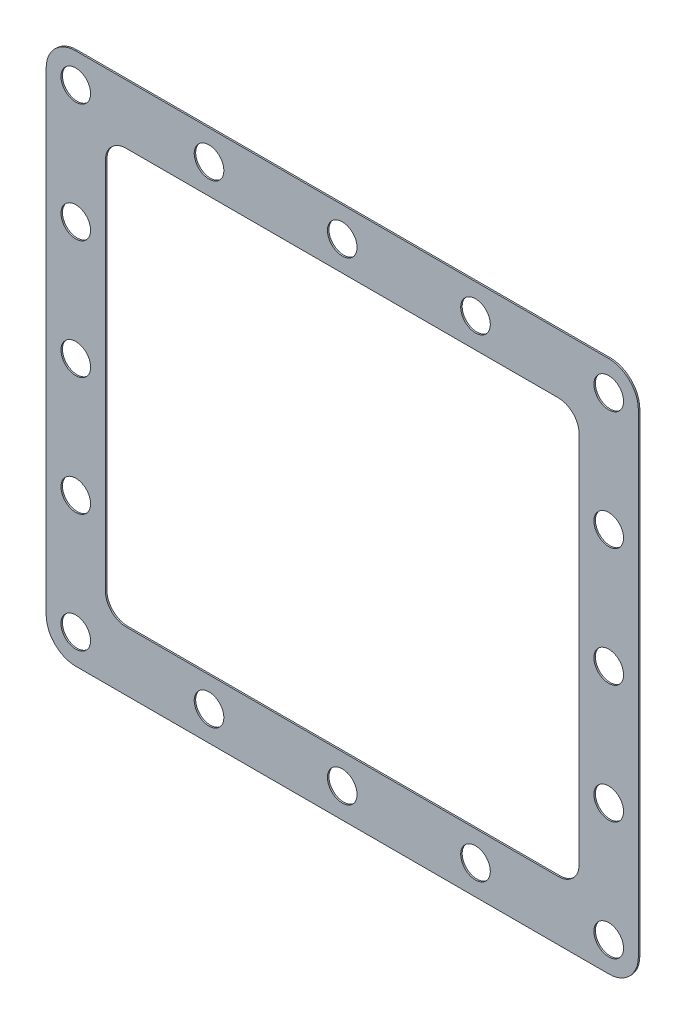
ISO-10303-21;
HEADER;
FILE_DESCRIPTION(('STEP AP214'),'2;1');
FILE_NAME('part.step','',(''),(''),'','','');
FILE_SCHEMA(('AUTOMOTIVE_DESIGN { 1 0 10303 214 1 1 1 1 }'));
ENDSEC;
DATA;
#1=APPLICATION_CONTEXT('core data for automotive mechanical design processes');
#2=APPLICATION_PROTOCOL_DEFINITION('international standard','automotive_design',2000,#1);
#3=PRODUCT_CONTEXT('',#1,'mechanical');
#4=PRODUCT('Part','Part','',(#3));
#5=PRODUCT_RELATED_PRODUCT_CATEGORY('part','',(#4));
#6=PRODUCT_DEFINITION_FORMATION('','',#4);
#7=PRODUCT_DEFINITION_CONTEXT('part definition',#1,'design');
#8=PRODUCT_DEFINITION('design','',#6,#7);
#9=PRODUCT_DEFINITION_SHAPE('','',#8);
#10=(LENGTH_UNIT() NAMED_UNIT(*) SI_UNIT(.MILLI.,.METRE.));
#11=(NAMED_UNIT(*) PLANE_ANGLE_UNIT() SI_UNIT($,.RADIAN.));
#12=(NAMED_UNIT(*) SI_UNIT($,.STERADIAN.) SOLID_ANGLE_UNIT());
#13=UNCERTAINTY_MEASURE_WITH_UNIT(LENGTH_MEASURE(1.E-05),#10,'distance_accuracy_value','');
#14=(GEOMETRIC_REPRESENTATION_CONTEXT(3) GLOBAL_UNCERTAINTY_ASSIGNED_CONTEXT((#13)) GLOBAL_UNIT_ASSIGNED_CONTEXT((#10,
#11,#12)) REPRESENTATION_CONTEXT('',''));
#15=CARTESIAN_POINT('',(0.,0.,0.));
#16=DIRECTION('',(0.,0.,1.));
#17=DIRECTION('',(1.,0.,0.));
#18=AXIS2_PLACEMENT_3D('',#15,#16,#17);
#19=CARTESIAN_POINT('',(90.,80.,0.5));
#20=DIRECTION('',(0.,0.,-1.));
#21=DIRECTION('',(-1.,0.,0.));
#22=AXIS2_PLACEMENT_3D('',#19,#20,#21);
#23=PLANE('',#22);
#24=CARTESIAN_POINT('',(90.,80.,0.5));
#25=DIRECTION('',(0.,0.,1.));
#26=DIRECTION('',(-1.,0.,0.));
#27=AXIS2_PLACEMENT_3D('',#24,#25,#26);
#28=CIRCLE('',#27,9.99999999999999);
#29=CARTESIAN_POINT('',(100.,79.9999999999999,0.5));
#30=VERTEX_POINT('',#29);
#31=CARTESIAN_POINT('',(89.9999999999999,90.,0.5));
#32=VERTEX_POINT('',#31);
#33=EDGE_CURVE('E217',#30,#32,#28,.T.);
#34=ORIENTED_EDGE('',*,*,#33,.T.);
#35=DIRECTION('',(-1.,0.,0.));
#36=VECTOR('',#35,1.);
#37=CARTESIAN_POINT('',(-89.9999999999999,90.,0.5));
#38=LINE('',#37,#36);
#39=CARTESIAN_POINT('',(-89.9999999999999,90.,0.5));
#40=VERTEX_POINT('',#39);
#41=EDGE_CURVE('E220',#32,#40,#38,.T.);
#42=ORIENTED_EDGE('',*,*,#41,.T.);
#43=CARTESIAN_POINT('',(-90.,80.,0.5));
#44=DIRECTION('',(0.,0.,1.));
#45=DIRECTION('',(-1.,0.,0.));
#46=AXIS2_PLACEMENT_3D('',#43,#44,#45);
#47=CIRCLE('',#46,9.99999999999999);
#48=CARTESIAN_POINT('',(-100.,79.9999999999999,0.5));
#49=VERTEX_POINT('',#48);
#50=EDGE_CURVE('E223',#40,#49,#47,.T.);
#51=ORIENTED_EDGE('',*,*,#50,.T.);
#52=DIRECTION('',(0.,-1.,0.));
#53=VECTOR('',#52,1.);
#54=CARTESIAN_POINT('',(-100.,-79.9999999999999,0.5));
#55=LINE('',#54,#53);
#56=CARTESIAN_POINT('',(-100.,-79.9999999999999,0.5));
#57=VERTEX_POINT('',#56);
#58=EDGE_CURVE('E225',#49,#57,#55,.T.);
#59=ORIENTED_EDGE('',*,*,#58,.T.);
#60=CARTESIAN_POINT('',(-90.,-80.,0.5));
#61=DIRECTION('',(0.,0.,1.));
#62=DIRECTION('',(-1.,0.,0.));
#63=AXIS2_PLACEMENT_3D('',#60,#61,#62);
#64=CIRCLE('',#63,9.99999999999999);
#65=CARTESIAN_POINT('',(-89.9999999999999,-90.,0.5));
#66=VERTEX_POINT('',#65);
#67=EDGE_CURVE('E227',#57,#66,#64,.T.);
#68=ORIENTED_EDGE('',*,*,#67,.T.);
#69=DIRECTION('',(1.,0.,0.));
#70=VECTOR('',#69,1.);
#71=CARTESIAN_POINT('',(-89.9999999999999,-90.,0.5));
#72=LINE('',#71,#70);
#73=CARTESIAN_POINT('',(89.9999999999999,-90.,0.5));
#74=VERTEX_POINT('',#73);
#75=EDGE_CURVE('E229',#66,#74,#72,.T.);
#76=ORIENTED_EDGE('',*,*,#75,.T.);
#77=CARTESIAN_POINT('',(90.,-80.,0.5));
#78=DIRECTION('',(0.,0.,1.));
#79=DIRECTION('',(1.,0.,0.));
#80=AXIS2_PLACEMENT_3D('',#77,#78,#79);
#81=CIRCLE('',#80,9.99999999999999);
#82=CARTESIAN_POINT('',(100.,-80.,0.5));
#83=VERTEX_POINT('',#82);
#84=EDGE_CURVE('E231',#74,#83,#81,.T.);
#85=ORIENTED_EDGE('',*,*,#84,.T.);
#86=DIRECTION('',(0.,1.,0.));
#87=VECTOR('',#86,1.);
#88=CARTESIAN_POINT('',(100.,-79.9999999999999,0.5));
#89=LINE('',#88,#87);
#90=EDGE_CURVE('E233',#83,#30,#89,.T.);
#91=ORIENTED_EDGE('',*,*,#90,.T.);
#92=EDGE_LOOP('',(#34,#42,#51,#59,#68,#76,#85,#91));
#93=FACE_BOUND('',#92,.T.);
#94=CARTESIAN_POINT('',(73.,63.,0.5));
#95=DIRECTION('',(0.,0.,1.));
#96=DIRECTION('',(-1.,0.,0.));
#97=AXIS2_PLACEMENT_3D('',#94,#95,#96);
#98=CIRCLE('',#97,7.);
#99=CARTESIAN_POINT('',(80.,63.,0.5));
#100=VERTEX_POINT('',#99);
#101=CARTESIAN_POINT('',(73.,70.,0.5));
#102=VERTEX_POINT('',#101);
#103=EDGE_CURVE('E149',#100,#102,#98,.T.);
#104=ORIENTED_EDGE('',*,*,#103,.F.);
#105=DIRECTION('',(0.,1.,0.));
#106=VECTOR('',#105,1.);
#107=CARTESIAN_POINT('',(80.,-63.,0.5));
#108=LINE('',#107,#106);
#109=CARTESIAN_POINT('',(80.,-63.,0.5));
#110=VERTEX_POINT('',#109);
#111=EDGE_CURVE('E184',#110,#100,#108,.T.);
#112=ORIENTED_EDGE('',*,*,#111,.F.);
#113=CARTESIAN_POINT('',(73.,-63.,0.5));
#114=DIRECTION('',(0.,0.,1.));
#115=DIRECTION('',(1.,0.,0.));
#116=AXIS2_PLACEMENT_3D('',#113,#114,#115);
#117=CIRCLE('',#116,7.00000000000001);
#118=CARTESIAN_POINT('',(73.,-70.,0.5));
#119=VERTEX_POINT('',#118);
#120=EDGE_CURVE('E182',#119,#110,#117,.T.);
#121=ORIENTED_EDGE('',*,*,#120,.F.);
#122=DIRECTION('',(1.,0.,0.));
#123=VECTOR('',#122,1.);
#124=CARTESIAN_POINT('',(-73.,-70.,0.5));
#125=LINE('',#124,#123);
#126=CARTESIAN_POINT('',(-73.,-70.,0.5));
#127=VERTEX_POINT('',#126);
#128=EDGE_CURVE('E180',#127,#119,#125,.T.);
#129=ORIENTED_EDGE('',*,*,#128,.F.);
#130=CARTESIAN_POINT('',(-73.,-63.,0.5));
#131=DIRECTION('',(0.,0.,1.));
#132=DIRECTION('',(-1.,0.,0.));
#133=AXIS2_PLACEMENT_3D('',#130,#131,#132);
#134=CIRCLE('',#133,7.00000000000001);
#135=CARTESIAN_POINT('',(-80.,-63.,0.5));
#136=VERTEX_POINT('',#135);
#137=EDGE_CURVE('E178',#136,#127,#134,.T.);
#138=ORIENTED_EDGE('',*,*,#137,.F.);
#139=DIRECTION('',(0.,-1.,0.));
#140=VECTOR('',#139,1.);
#141=CARTESIAN_POINT('',(-80.,-63.,0.5));
#142=LINE('',#141,#140);
#143=CARTESIAN_POINT('',(-80.,63.,0.5));
#144=VERTEX_POINT('',#143);
#145=EDGE_CURVE('E173',#144,#136,#142,.T.);
#146=ORIENTED_EDGE('',*,*,#145,.F.);
#147=CARTESIAN_POINT('',(-73.,63.,0.5));
#148=DIRECTION('',(0.,0.,1.));
#149=DIRECTION('',(-1.,0.,0.));
#150=AXIS2_PLACEMENT_3D('',#147,#148,#149);
#151=CIRCLE('',#150,7.00000000000001);
#152=CARTESIAN_POINT('',(-73.,70.,0.5));
#153=VERTEX_POINT('',#152);
#154=EDGE_CURVE('E171',#153,#144,#151,.T.);
#155=ORIENTED_EDGE('',*,*,#154,.F.);
#156=DIRECTION('',(-1.,0.,0.));
#157=VECTOR('',#156,1.);
#158=CARTESIAN_POINT('',(-73.,70.,0.5));
#159=LINE('',#158,#157);
#160=EDGE_CURVE('E157',#102,#153,#159,.T.);
#161=ORIENTED_EDGE('',*,*,#160,.F.);
#162=EDGE_LOOP('',(#104,#112,#121,#129,#138,#146,#155,#161));
#163=FACE_BOUND('',#162,.T.);
#164=CARTESIAN_POINT('',(90.,-80.,0.5));
#165=DIRECTION('',(0.,0.,1.));
#166=DIRECTION('',(1.,0.,0.));
#167=AXIS2_PLACEMENT_3D('',#164,#165,#166);
#168=CIRCLE('',#167,5.00000000000001);
#169=CARTESIAN_POINT('',(95.,-80.,0.5));
#170=VERTEX_POINT('',#169);
#171=EDGE_CURVE('E187',#170,#170,#168,.T.);
#172=ORIENTED_EDGE('',*,*,#171,.F.);
#173=EDGE_LOOP('',(#172));
#174=FACE_BOUND('',#173,.T.);
#175=CARTESIAN_POINT('',(90.,80.,0.5));
#176=DIRECTION('',(0.,0.,1.));
#177=DIRECTION('',(1.,0.,0.));
#178=AXIS2_PLACEMENT_3D('',#175,#176,#177);
#179=CIRCLE('',#178,5.00000000000001);
#180=CARTESIAN_POINT('',(95.,80.,0.5));
#181=VERTEX_POINT('',#180);
#182=EDGE_CURVE('E515',#181,#181,#179,.T.);
#183=ORIENTED_EDGE('',*,*,#182,.F.);
#184=EDGE_LOOP('',(#183));
#185=FACE_BOUND('',#184,.T.);
#186=CARTESIAN_POINT('',(-90.,80.,0.5));
#187=DIRECTION('',(0.,0.,1.));
#188=DIRECTION('',(1.,0.,0.));
#189=AXIS2_PLACEMENT_3D('',#186,#187,#188);
#190=CIRCLE('',#189,4.99999999999999);
#191=CARTESIAN_POINT('',(-85.,80.,0.5));
#192=VERTEX_POINT('',#191);
#193=EDGE_CURVE('E509',#192,#192,#190,.T.);
#194=ORIENTED_EDGE('',*,*,#193,.F.);
#195=EDGE_LOOP('',(#194));
#196=FACE_BOUND('',#195,.T.);
#197=CARTESIAN_POINT('',(-90.,-80.,0.5));
#198=DIRECTION('',(0.,0.,1.));
#199=DIRECTION('',(1.,0.,0.));
#200=AXIS2_PLACEMENT_3D('',#197,#198,#199);
#201=CIRCLE('',#200,5.00000000000001);
#202=CARTESIAN_POINT('',(-85.,-80.,0.5));
#203=VERTEX_POINT('',#202);
#204=EDGE_CURVE('E503',#203,#203,#201,.T.);
#205=ORIENTED_EDGE('',*,*,#204,.F.);
#206=EDGE_LOOP('',(#205));
#207=FACE_BOUND('',#206,.T.);
#208=CARTESIAN_POINT('',(90.,0.,0.5));
#209=DIRECTION('',(0.,0.,1.));
#210=DIRECTION('',(1.,0.,0.));
#211=AXIS2_PLACEMENT_3D('',#208,#209,#210);
#212=CIRCLE('',#211,5.);
#213=CARTESIAN_POINT('',(95.,0.,0.5));
#214=VERTEX_POINT('',#213);
#215=EDGE_CURVE('E497',#214,#214,#212,.T.);
#216=ORIENTED_EDGE('',*,*,#215,.F.);
#217=EDGE_LOOP('',(#216));
#218=FACE_BOUND('',#217,.T.);
#219=CARTESIAN_POINT('',(90.,-40.,0.5));
#220=DIRECTION('',(0.,0.,1.));
#221=DIRECTION('',(1.,0.,0.));
#222=AXIS2_PLACEMENT_3D('',#219,#220,#221);
#223=CIRCLE('',#222,5.00000000000001);
#224=CARTESIAN_POINT('',(95.,-40.,0.5));
#225=VERTEX_POINT('',#224);
#226=EDGE_CURVE('E491',#225,#225,#223,.T.);
#227=ORIENTED_EDGE('',*,*,#226,.F.);
#228=EDGE_LOOP('',(#227));
#229=FACE_BOUND('',#228,.T.);
#230=CARTESIAN_POINT('',(90.,40.,0.5));
#231=DIRECTION('',(0.,0.,1.));
#232=DIRECTION('',(1.,0.,0.));
#233=AXIS2_PLACEMENT_3D('',#230,#231,#232);
#234=CIRCLE('',#233,4.99999999999999);
#235=CARTESIAN_POINT('',(95.,40.,0.5));
#236=VERTEX_POINT('',#235);
#237=EDGE_CURVE('E485',#236,#236,#234,.T.);
#238=ORIENTED_EDGE('',*,*,#237,.F.);
#239=EDGE_LOOP('',(#238));
#240=FACE_BOUND('',#239,.T.);
#241=CARTESIAN_POINT('',(-90.0000000000001,-40.,0.5));
#242=DIRECTION('',(0.,0.,1.));
#243=DIRECTION('',(-1.,0.,0.));
#244=AXIS2_PLACEMENT_3D('',#241,#242,#243);
#245=CIRCLE('',#244,5.00000000000001);
#246=CARTESIAN_POINT('',(-95.0000000000001,-40.,0.5));
#247=VERTEX_POINT('',#246);
#248=EDGE_CURVE('E479',#247,#247,#245,.T.);
#249=ORIENTED_EDGE('',*,*,#248,.F.);
#250=EDGE_LOOP('',(#249));
#251=FACE_BOUND('',#250,.T.);
#252=CARTESIAN_POINT('',(-90.0000000000001,0.,0.5));
#253=DIRECTION('',(0.,0.,1.));
#254=DIRECTION('',(-1.,0.,0.));
#255=AXIS2_PLACEMENT_3D('',#252,#253,#254);
#256=CIRCLE('',#255,5.);
#257=CARTESIAN_POINT('',(-95.0000000000001,0.,0.5));
#258=VERTEX_POINT('',#257);
#259=EDGE_CURVE('E473',#258,#258,#256,.T.);
#260=ORIENTED_EDGE('',*,*,#259,.F.);
#261=EDGE_LOOP('',(#260));
#262=FACE_BOUND('',#261,.T.);
#263=CARTESIAN_POINT('',(-90.0000000000001,40.,0.5));
#264=DIRECTION('',(0.,0.,1.));
#265=DIRECTION('',(-1.,0.,0.));
#266=AXIS2_PLACEMENT_3D('',#263,#264,#265);
#267=CIRCLE('',#266,4.99999999999999);
#268=CARTESIAN_POINT('',(-95.0000000000001,40.,0.5));
#269=VERTEX_POINT('',#268);
#270=EDGE_CURVE('E467',#269,#269,#267,.T.);
#271=ORIENTED_EDGE('',*,*,#270,.F.);
#272=EDGE_LOOP('',(#271));
#273=FACE_BOUND('',#272,.T.);
#274=CARTESIAN_POINT('',(0.,80.,0.5));
#275=DIRECTION('',(0.,0.,1.));
#276=DIRECTION('',(1.,0.,0.));
#277=AXIS2_PLACEMENT_3D('',#274,#275,#276);
#278=CIRCLE('',#277,5.);
#279=CARTESIAN_POINT('',(4.99999999999998,80.,0.5));
#280=VERTEX_POINT('',#279);
#281=EDGE_CURVE('E461',#280,#280,#278,.T.);
#282=ORIENTED_EDGE('',*,*,#281,.F.);
#283=EDGE_LOOP('',(#282));
#284=FACE_BOUND('',#283,.T.);
#285=CARTESIAN_POINT('',(-45.,80.,0.5));
#286=DIRECTION('',(0.,0.,1.));
#287=DIRECTION('',(1.,0.,0.));
#288=AXIS2_PLACEMENT_3D('',#285,#286,#287);
#289=CIRCLE('',#288,5.);
#290=CARTESIAN_POINT('',(-40.,80.,0.5));
#291=VERTEX_POINT('',#290);
#292=EDGE_CURVE('E455',#291,#291,#289,.T.);
#293=ORIENTED_EDGE('',*,*,#292,.F.);
#294=EDGE_LOOP('',(#293));
#295=FACE_BOUND('',#294,.T.);
#296=CARTESIAN_POINT('',(45.,80.,0.5));
#297=DIRECTION('',(0.,0.,1.));
#298=DIRECTION('',(1.,0.,0.));
#299=AXIS2_PLACEMENT_3D('',#296,#297,#298);
#300=CIRCLE('',#299,5.00000000000001);
#301=CARTESIAN_POINT('',(50.,80.,0.5));
#302=VERTEX_POINT('',#301);
#303=EDGE_CURVE('E449',#302,#302,#300,.T.);
#304=ORIENTED_EDGE('',*,*,#303,.F.);
#305=EDGE_LOOP('',(#304));
#306=FACE_BOUND('',#305,.T.);
#307=CARTESIAN_POINT('',(0.,-80.,0.5));
#308=DIRECTION('',(0.,0.,1.));
#309=DIRECTION('',(1.,0.,0.));
#310=AXIS2_PLACEMENT_3D('',#307,#308,#309);
#311=CIRCLE('',#310,5.);
#312=CARTESIAN_POINT('',(4.99999999999997,-80.,0.5));
#313=VERTEX_POINT('',#312);
#314=EDGE_CURVE('E443',#313,#313,#311,.T.);
#315=ORIENTED_EDGE('',*,*,#314,.F.);
#316=EDGE_LOOP('',(#315));
#317=FACE_BOUND('',#316,.T.);
#318=CARTESIAN_POINT('',(-45.,-80.,0.5));
#319=DIRECTION('',(0.,0.,1.));
#320=DIRECTION('',(1.,0.,0.));
#321=AXIS2_PLACEMENT_3D('',#318,#319,#320);
#322=CIRCLE('',#321,5.);
#323=CARTESIAN_POINT('',(-40.,-80.,0.5));
#324=VERTEX_POINT('',#323);
#325=EDGE_CURVE('E437',#324,#324,#322,.T.);
#326=ORIENTED_EDGE('',*,*,#325,.F.);
#327=EDGE_LOOP('',(#326));
#328=FACE_BOUND('',#327,.T.);
#329=CARTESIAN_POINT('',(45.,-80.,0.5));
#330=DIRECTION('',(0.,0.,1.));
#331=DIRECTION('',(1.,0.,0.));
#332=AXIS2_PLACEMENT_3D('',#329,#330,#331);
#333=CIRCLE('',#332,5.00000000000001);
#334=CARTESIAN_POINT('',(50.,-80.,0.5));
#335=VERTEX_POINT('',#334);
#336=EDGE_CURVE('E428',#335,#335,#333,.T.);
#337=ORIENTED_EDGE('',*,*,#336,.F.);
#338=EDGE_LOOP('',(#337));
#339=FACE_BOUND('',#338,.T.);
#340=ADVANCED_FACE('F36',(#93,#163,#174,#185,#196,#207,#218,#229,#240,#251,#262,#273,#284,#295,
#306,#317,#328,#339),#23,.F.);
#341=CARTESIAN_POINT('',(90.,80.,0.));
#342=DIRECTION('',(0.,0.,-1.));
#343=DIRECTION('',(-1.,0.,0.));
#344=AXIS2_PLACEMENT_3D('',#341,#342,#343);
#345=PLANE('',#344);
#346=CARTESIAN_POINT('',(-45.,-80.,0.));
#347=DIRECTION('',(0.,0.,1.));
#348=DIRECTION('',(1.,0.,0.));
#349=AXIS2_PLACEMENT_3D('',#346,#347,#348);
#350=CIRCLE('',#349,5.);
#351=CARTESIAN_POINT('',(-40.,-80.,0.));
#352=VERTEX_POINT('',#351);
#353=EDGE_CURVE('E434',#352,#352,#350,.T.);
#354=ORIENTED_EDGE('',*,*,#353,.T.);
#355=EDGE_LOOP('',(#354));
#356=FACE_BOUND('',#355,.T.);
#357=CARTESIAN_POINT('',(45.,80.,0.));
#358=DIRECTION('',(0.,0.,1.));
#359=DIRECTION('',(1.,0.,0.));
#360=AXIS2_PLACEMENT_3D('',#357,#358,#359);
#361=CIRCLE('',#360,5.00000000000001);
#362=CARTESIAN_POINT('',(50.,80.,0.));
#363=VERTEX_POINT('',#362);
#364=EDGE_CURVE('E446',#363,#363,#361,.T.);
#365=ORIENTED_EDGE('',*,*,#364,.T.);
#366=EDGE_LOOP('',(#365));
#367=FACE_BOUND('',#366,.T.);
#368=CARTESIAN_POINT('',(0.,80.,0.));
#369=DIRECTION('',(0.,0.,1.));
#370=DIRECTION('',(1.,0.,0.));
#371=AXIS2_PLACEMENT_3D('',#368,#369,#370);
#372=CIRCLE('',#371,5.);
#373=CARTESIAN_POINT('',(4.99999999999998,80.,0.));
#374=VERTEX_POINT('',#373);
#375=EDGE_CURVE('E458',#374,#374,#372,.T.);
#376=ORIENTED_EDGE('',*,*,#375,.T.);
#377=EDGE_LOOP('',(#376));
#378=FACE_BOUND('',#377,.T.);
#379=CARTESIAN_POINT('',(-90.0000000000001,0.,0.));
#380=DIRECTION('',(0.,0.,1.));
#381=DIRECTION('',(-1.,0.,0.));
#382=AXIS2_PLACEMENT_3D('',#379,#380,#381);
#383=CIRCLE('',#382,5.);
#384=CARTESIAN_POINT('',(-95.0000000000001,0.,0.));
#385=VERTEX_POINT('',#384);
#386=EDGE_CURVE('E470',#385,#385,#383,.T.);
#387=ORIENTED_EDGE('',*,*,#386,.T.);
#388=EDGE_LOOP('',(#387));
#389=FACE_BOUND('',#388,.T.);
#390=CARTESIAN_POINT('',(90.,40.,0.));
#391=DIRECTION('',(0.,0.,1.));
#392=DIRECTION('',(1.,0.,0.));
#393=AXIS2_PLACEMENT_3D('',#390,#391,#392);
#394=CIRCLE('',#393,4.99999999999999);
#395=CARTESIAN_POINT('',(95.,40.,0.));
#396=VERTEX_POINT('',#395);
#397=EDGE_CURVE('E482',#396,#396,#394,.T.);
#398=ORIENTED_EDGE('',*,*,#397,.T.);
#399=EDGE_LOOP('',(#398));
#400=FACE_BOUND('',#399,.T.);
#401=CARTESIAN_POINT('',(90.,0.,0.));
#402=DIRECTION('',(0.,0.,1.));
#403=DIRECTION('',(1.,0.,0.));
#404=AXIS2_PLACEMENT_3D('',#401,#402,#403);
#405=CIRCLE('',#404,5.);
#406=CARTESIAN_POINT('',(95.,0.,0.));
#407=VERTEX_POINT('',#406);
#408=EDGE_CURVE('E494',#407,#407,#405,.T.);
#409=ORIENTED_EDGE('',*,*,#408,.T.);
#410=EDGE_LOOP('',(#409));
#411=FACE_BOUND('',#410,.T.);
#412=CARTESIAN_POINT('',(-90.,80.,0.));
#413=DIRECTION('',(0.,0.,1.));
#414=DIRECTION('',(1.,0.,0.));
#415=AXIS2_PLACEMENT_3D('',#412,#413,#414);
#416=CIRCLE('',#415,4.99999999999999);
#417=CARTESIAN_POINT('',(-85.,80.,0.));
#418=VERTEX_POINT('',#417);
#419=EDGE_CURVE('E506',#418,#418,#416,.T.);
#420=ORIENTED_EDGE('',*,*,#419,.T.);
#421=EDGE_LOOP('',(#420));
#422=FACE_BOUND('',#421,.T.);
#423=CARTESIAN_POINT('',(90.,-80.,0.));
#424=DIRECTION('',(0.,0.,1.));
#425=DIRECTION('',(1.,0.,0.));
#426=AXIS2_PLACEMENT_3D('',#423,#424,#425);
#427=CIRCLE('',#426,5.00000000000001);
#428=CARTESIAN_POINT('',(95.,-80.,0.));
#429=VERTEX_POINT('',#428);
#430=EDGE_CURVE('E518',#429,#429,#427,.T.);
#431=ORIENTED_EDGE('',*,*,#430,.T.);
#432=EDGE_LOOP('',(#431));
#433=FACE_BOUND('',#432,.T.);
#434=CARTESIAN_POINT('',(90.,80.,0.));
#435=DIRECTION('',(0.,0.,1.));
#436=DIRECTION('',(-1.,0.,0.));
#437=AXIS2_PLACEMENT_3D('',#434,#435,#436);
#438=CIRCLE('',#437,9.99999999999999);
#439=CARTESIAN_POINT('',(100.,79.9999999999999,0.));
#440=VERTEX_POINT('',#439);
#441=CARTESIAN_POINT('',(89.9999999999999,90.,0.));
#442=VERTEX_POINT('',#441);
#443=EDGE_CURVE('E165',#440,#442,#438,.T.);
#444=ORIENTED_EDGE('',*,*,#443,.F.);
#445=DIRECTION('',(0.,1.,0.));
#446=VECTOR('',#445,1.);
#447=CARTESIAN_POINT('',(100.,-79.9999999999999,0.));
#448=LINE('',#447,#446);
#449=CARTESIAN_POINT('',(100.,-80.,0.));
#450=VERTEX_POINT('',#449);
#451=EDGE_CURVE('E221',#450,#440,#448,.T.);
#452=ORIENTED_EDGE('',*,*,#451,.F.);
#453=CARTESIAN_POINT('',(90.,-80.,0.));
#454=DIRECTION('',(0.,0.,1.));
#455=DIRECTION('',(1.,0.,0.));
#456=AXIS2_PLACEMENT_3D('',#453,#454,#455);
#457=CIRCLE('',#456,9.99999999999999);
#458=CARTESIAN_POINT('',(89.9999999999999,-90.,0.));
#459=VERTEX_POINT('',#458);
#460=EDGE_CURVE('E248',#459,#450,#457,.T.);
#461=ORIENTED_EDGE('',*,*,#460,.F.);
#462=DIRECTION('',(1.,0.,0.));
#463=VECTOR('',#462,1.);
#464=CARTESIAN_POINT('',(-89.9999999999999,-90.,0.));
#465=LINE('',#464,#463);
#466=CARTESIAN_POINT('',(-89.9999999999999,-90.,0.));
#467=VERTEX_POINT('',#466);
#468=EDGE_CURVE('E246',#467,#459,#465,.T.);
#469=ORIENTED_EDGE('',*,*,#468,.F.);
#470=CARTESIAN_POINT('',(-90.,-80.,0.));
#471=DIRECTION('',(0.,0.,1.));
#472=DIRECTION('',(-1.,0.,0.));
#473=AXIS2_PLACEMENT_3D('',#470,#471,#472);
#474=CIRCLE('',#473,9.99999999999999);
#475=CARTESIAN_POINT('',(-100.,-79.9999999999999,0.));
#476=VERTEX_POINT('',#475);
#477=EDGE_CURVE('E244',#476,#467,#474,.T.);
#478=ORIENTED_EDGE('',*,*,#477,.F.);
#479=DIRECTION('',(0.,-1.,0.));
#480=VECTOR('',#479,1.);
#481=CARTESIAN_POINT('',(-100.,-79.9999999999999,0.));
#482=LINE('',#481,#480);
#483=CARTESIAN_POINT('',(-100.,79.9999999999999,0.));
#484=VERTEX_POINT('',#483);
#485=EDGE_CURVE('E242',#484,#476,#482,.T.);
#486=ORIENTED_EDGE('',*,*,#485,.F.);
#487=CARTESIAN_POINT('',(-90.,80.,0.));
#488=DIRECTION('',(0.,0.,1.));
#489=DIRECTION('',(-1.,0.,0.));
#490=AXIS2_PLACEMENT_3D('',#487,#488,#489);
#491=CIRCLE('',#490,9.99999999999999);
#492=CARTESIAN_POINT('',(-89.9999999999999,90.,0.));
#493=VERTEX_POINT('',#492);
#494=EDGE_CURVE('E240',#493,#484,#491,.T.);
#495=ORIENTED_EDGE('',*,*,#494,.F.);
#496=DIRECTION('',(-1.,0.,0.));
#497=VECTOR('',#496,1.);
#498=CARTESIAN_POINT('',(-89.9999999999999,90.,0.));
#499=LINE('',#498,#497);
#500=EDGE_CURVE('E238',#442,#493,#499,.T.);
#501=ORIENTED_EDGE('',*,*,#500,.F.);
#502=EDGE_LOOP('',(#444,#452,#461,#469,#478,#486,#495,#501));
#503=FACE_BOUND('',#502,.T.);
#504=DIRECTION('',(0.,1.,0.));
#505=VECTOR('',#504,1.);
#506=CARTESIAN_POINT('',(80.,-63.,0.));
#507=LINE('',#506,#505);
#508=CARTESIAN_POINT('',(80.,-63.,0.));
#509=VERTEX_POINT('',#508);
#510=CARTESIAN_POINT('',(80.,63.,0.));
#511=VERTEX_POINT('',#510);
#512=EDGE_CURVE('E158',#509,#511,#507,.T.);
#513=ORIENTED_EDGE('',*,*,#512,.T.);
#514=CARTESIAN_POINT('',(73.,63.,0.));
#515=DIRECTION('',(0.,0.,1.));
#516=DIRECTION('',(-1.,0.,0.));
#517=AXIS2_PLACEMENT_3D('',#514,#515,#516);
#518=CIRCLE('',#517,7.);
#519=CARTESIAN_POINT('',(73.,70.,0.));
#520=VERTEX_POINT('',#519);
#521=EDGE_CURVE('E59',#511,#520,#518,.T.);
#522=ORIENTED_EDGE('',*,*,#521,.T.);
#523=DIRECTION('',(-1.,0.,0.));
#524=VECTOR('',#523,1.);
#525=CARTESIAN_POINT('',(-73.,70.,0.));
#526=LINE('',#525,#524);
#527=CARTESIAN_POINT('',(-73.,70.,0.));
#528=VERTEX_POINT('',#527);
#529=EDGE_CURVE('E164',#520,#528,#526,.T.);
#530=ORIENTED_EDGE('',*,*,#529,.T.);
#531=CARTESIAN_POINT('',(-73.,63.,0.));
#532=DIRECTION('',(0.,0.,1.));
#533=DIRECTION('',(-1.,0.,0.));
#534=AXIS2_PLACEMENT_3D('',#531,#532,#533);
#535=CIRCLE('',#534,7.00000000000001);
#536=CARTESIAN_POINT('',(-80.,63.,0.));
#537=VERTEX_POINT('',#536);
#538=EDGE_CURVE('E189',#528,#537,#535,.T.);
#539=ORIENTED_EDGE('',*,*,#538,.T.);
#540=DIRECTION('',(0.,-1.,0.));
#541=VECTOR('',#540,1.);
#542=CARTESIAN_POINT('',(-80.,-63.,0.));
#543=LINE('',#542,#541);
#544=CARTESIAN_POINT('',(-80.,-63.,0.));
#545=VERTEX_POINT('',#544);
#546=EDGE_CURVE('E192',#537,#545,#543,.T.);
#547=ORIENTED_EDGE('',*,*,#546,.T.);
#548=CARTESIAN_POINT('',(-73.,-63.,0.));
#549=DIRECTION('',(0.,0.,1.));
#550=DIRECTION('',(-1.,0.,0.));
#551=AXIS2_PLACEMENT_3D('',#548,#549,#550);
#552=CIRCLE('',#551,7.00000000000001);
#553=CARTESIAN_POINT('',(-73.,-70.,0.));
#554=VERTEX_POINT('',#553);
#555=EDGE_CURVE('E195',#545,#554,#552,.T.);
#556=ORIENTED_EDGE('',*,*,#555,.T.);
#557=DIRECTION('',(1.,0.,0.));
#558=VECTOR('',#557,1.);
#559=CARTESIAN_POINT('',(-73.,-70.,0.));
#560=LINE('',#559,#558);
#561=CARTESIAN_POINT('',(73.,-70.,0.));
#562=VERTEX_POINT('',#561);
#563=EDGE_CURVE('E198',#554,#562,#560,.T.);
#564=ORIENTED_EDGE('',*,*,#563,.T.);
#565=CARTESIAN_POINT('',(73.,-63.,0.));
#566=DIRECTION('',(0.,0.,1.));
#567=DIRECTION('',(1.,0.,0.));
#568=AXIS2_PLACEMENT_3D('',#565,#566,#567);
#569=CIRCLE('',#568,7.00000000000001);
#570=EDGE_CURVE('E201',#562,#509,#569,.T.);
#571=ORIENTED_EDGE('',*,*,#570,.T.);
#572=EDGE_LOOP('',(#513,#522,#530,#539,#547,#556,#564,#571));
#573=FACE_BOUND('',#572,.T.);
#574=CARTESIAN_POINT('',(90.,80.,0.));
#575=DIRECTION('',(0.,0.,1.));
#576=DIRECTION('',(1.,0.,0.));
#577=AXIS2_PLACEMENT_3D('',#574,#575,#576);
#578=CIRCLE('',#577,5.00000000000001);
#579=CARTESIAN_POINT('',(95.,80.,0.));
#580=VERTEX_POINT('',#579);
#581=EDGE_CURVE('E512',#580,#580,#578,.T.);
#582=ORIENTED_EDGE('',*,*,#581,.T.);
#583=EDGE_LOOP('',(#582));
#584=FACE_BOUND('',#583,.T.);
#585=CARTESIAN_POINT('',(-90.,-80.,0.));
#586=DIRECTION('',(0.,0.,1.));
#587=DIRECTION('',(1.,0.,0.));
#588=AXIS2_PLACEMENT_3D('',#585,#586,#587);
#589=CIRCLE('',#588,5.00000000000001);
#590=CARTESIAN_POINT('',(-85.,-80.,0.));
#591=VERTEX_POINT('',#590);
#592=EDGE_CURVE('E500',#591,#591,#589,.T.);
#593=ORIENTED_EDGE('',*,*,#592,.T.);
#594=EDGE_LOOP('',(#593));
#595=FACE_BOUND('',#594,.T.);
#596=CARTESIAN_POINT('',(90.,-40.,0.));
#597=DIRECTION('',(0.,0.,1.));
#598=DIRECTION('',(1.,0.,0.));
#599=AXIS2_PLACEMENT_3D('',#596,#597,#598);
#600=CIRCLE('',#599,5.00000000000001);
#601=CARTESIAN_POINT('',(95.,-40.,0.));
#602=VERTEX_POINT('',#601);
#603=EDGE_CURVE('E488',#602,#602,#600,.T.);
#604=ORIENTED_EDGE('',*,*,#603,.T.);
#605=EDGE_LOOP('',(#604));
#606=FACE_BOUND('',#605,.T.);
#607=CARTESIAN_POINT('',(-90.0000000000001,-40.,0.));
#608=DIRECTION('',(0.,0.,1.));
#609=DIRECTION('',(-1.,0.,0.));
#610=AXIS2_PLACEMENT_3D('',#607,#608,#609);
#611=CIRCLE('',#610,5.00000000000001);
#612=CARTESIAN_POINT('',(-95.0000000000001,-40.,0.));
#613=VERTEX_POINT('',#612);
#614=EDGE_CURVE('E476',#613,#613,#611,.T.);
#615=ORIENTED_EDGE('',*,*,#614,.T.);
#616=EDGE_LOOP('',(#615));
#617=FACE_BOUND('',#616,.T.);
#618=CARTESIAN_POINT('',(-90.0000000000001,40.,0.));
#619=DIRECTION('',(0.,0.,1.));
#620=DIRECTION('',(-1.,0.,0.));
#621=AXIS2_PLACEMENT_3D('',#618,#619,#620);
#622=CIRCLE('',#621,4.99999999999999);
#623=CARTESIAN_POINT('',(-95.0000000000001,40.,0.));
#624=VERTEX_POINT('',#623);
#625=EDGE_CURVE('E464',#624,#624,#622,.T.);
#626=ORIENTED_EDGE('',*,*,#625,.T.);
#627=EDGE_LOOP('',(#626));
#628=FACE_BOUND('',#627,.T.);
#629=CARTESIAN_POINT('',(-45.,80.,0.));
#630=DIRECTION('',(0.,0.,1.));
#631=DIRECTION('',(1.,0.,0.));
#632=AXIS2_PLACEMENT_3D('',#629,#630,#631);
#633=CIRCLE('',#632,5.);
#634=CARTESIAN_POINT('',(-40.,80.,0.));
#635=VERTEX_POINT('',#634);
#636=EDGE_CURVE('E452',#635,#635,#633,.T.);
#637=ORIENTED_EDGE('',*,*,#636,.T.);
#638=EDGE_LOOP('',(#637));
#639=FACE_BOUND('',#638,.T.);
#640=CARTESIAN_POINT('',(0.,-80.,0.));
#641=DIRECTION('',(0.,0.,1.));
#642=DIRECTION('',(1.,0.,0.));
#643=AXIS2_PLACEMENT_3D('',#640,#641,#642);
#644=CIRCLE('',#643,5.);
#645=CARTESIAN_POINT('',(4.99999999999997,-80.,0.));
#646=VERTEX_POINT('',#645);
#647=EDGE_CURVE('E440',#646,#646,#644,.T.);
#648=ORIENTED_EDGE('',*,*,#647,.T.);
#649=EDGE_LOOP('',(#648));
#650=FACE_BOUND('',#649,.T.);
#651=CARTESIAN_POINT('',(45.,-80.,0.));
#652=DIRECTION('',(0.,0.,1.));
#653=DIRECTION('',(1.,0.,0.));
#654=AXIS2_PLACEMENT_3D('',#651,#652,#653);
#655=CIRCLE('',#654,5.00000000000001);
#656=CARTESIAN_POINT('',(50.,-80.,0.));
#657=VERTEX_POINT('',#656);
#658=EDGE_CURVE('E431',#657,#657,#655,.T.);
#659=ORIENTED_EDGE('',*,*,#658,.T.);
#660=EDGE_LOOP('',(#659));
#661=FACE_BOUND('',#660,.T.);
#662=ADVANCED_FACE('F278',(#356,#367,#378,#389,#400,#411,#422,#433,#503,#573,#584,#595,#606,
#617,#628,#639,#650,#661),#345,.T.);
#663=CARTESIAN_POINT('',(90.,80.,0.5));
#664=DIRECTION('',(0.,0.,-1.));
#665=DIRECTION('',(-1.,0.,0.));
#666=AXIS2_PLACEMENT_3D('',#663,#664,#665);
#667=CYLINDRICAL_SURFACE('',#666,9.99999999999999);
#668=ORIENTED_EDGE('',*,*,#443,.T.);
#669=DIRECTION('',(0.,0.,-1.));
#670=VECTOR('',#669,1.);
#671=CARTESIAN_POINT('',(89.9999999999999,90.,0.5));
#672=LINE('',#671,#670);
#673=EDGE_CURVE('E11',#32,#442,#672,.T.);
#674=ORIENTED_EDGE('',*,*,#673,.F.);
#675=ORIENTED_EDGE('',*,*,#33,.F.);
#676=DIRECTION('',(0.,0.,-1.));
#677=VECTOR('',#676,1.);
#678=CARTESIAN_POINT('',(100.,79.9999999999999,0.5));
#679=LINE('',#678,#677);
#680=EDGE_CURVE('E235',#30,#440,#679,.T.);
#681=ORIENTED_EDGE('',*,*,#680,.T.);
#682=EDGE_LOOP('',(#668,#674,#675,#681));
#683=FACE_BOUND('',#682,.T.);
#684=ADVANCED_FACE('F38',(#683),#667,.T.);
#685=CARTESIAN_POINT('',(-89.9999999999999,90.,0.5));
#686=DIRECTION('',(0.,-1.,0.));
#687=DIRECTION('',(0.,0.,-1.));
#688=AXIS2_PLACEMENT_3D('',#685,#686,#687);
#689=PLANE('',#688);
#690=ORIENTED_EDGE('',*,*,#500,.T.);
#691=DIRECTION('',(0.,0.,-1.));
#692=VECTOR('',#691,1.);
#693=CARTESIAN_POINT('',(-89.9999999999999,90.,0.5));
#694=LINE('',#693,#692);
#695=EDGE_CURVE('E44',#40,#493,#694,.T.);
#696=ORIENTED_EDGE('',*,*,#695,.F.);
#697=ORIENTED_EDGE('',*,*,#41,.F.);
#698=ORIENTED_EDGE('',*,*,#673,.T.);
#699=EDGE_LOOP('',(#690,#696,#697,#698));
#700=FACE_BOUND('',#699,.T.);
#701=ADVANCED_FACE('F295',(#700),#689,.F.);
#702=CARTESIAN_POINT('',(-90.,80.,0.5));
#703=DIRECTION('',(0.,0.,-1.));
#704=DIRECTION('',(-1.,0.,0.));
#705=AXIS2_PLACEMENT_3D('',#702,#703,#704);
#706=CYLINDRICAL_SURFACE('',#705,9.99999999999999);
#707=ORIENTED_EDGE('',*,*,#494,.T.);
#708=DIRECTION('',(0.,0.,-1.));
#709=VECTOR('',#708,1.);
#710=CARTESIAN_POINT('',(-100.,79.9999999999999,0.5));
#711=LINE('',#710,#709);
#712=EDGE_CURVE('E265',#49,#484,#711,.T.);
#713=ORIENTED_EDGE('',*,*,#712,.F.);
#714=ORIENTED_EDGE('',*,*,#50,.F.);
#715=ORIENTED_EDGE('',*,*,#695,.T.);
#716=EDGE_LOOP('',(#707,#713,#714,#715));
#717=FACE_BOUND('',#716,.T.);
#718=ADVANCED_FACE('F272',(#717),#706,.T.);
#719=CARTESIAN_POINT('',(-100.,-79.9999999999999,0.5));
#720=DIRECTION('',(1.,0.,0.));
#721=DIRECTION('',(0.,1.,0.));
#722=AXIS2_PLACEMENT_3D('',#719,#720,#721);
#723=PLANE('',#722);
#724=ORIENTED_EDGE('',*,*,#485,.T.);
#725=DIRECTION('',(0.,0.,-1.));
#726=VECTOR('',#725,1.);
#727=CARTESIAN_POINT('',(-100.,-79.9999999999999,0.5));
#728=LINE('',#727,#726);
#729=EDGE_CURVE('E262',#57,#476,#728,.T.);
#730=ORIENTED_EDGE('',*,*,#729,.F.);
#731=ORIENTED_EDGE('',*,*,#58,.F.);
#732=ORIENTED_EDGE('',*,*,#712,.T.);
#733=EDGE_LOOP('',(#724,#730,#731,#732));
#734=FACE_BOUND('',#733,.T.);
#735=ADVANCED_FACE('F284',(#734),#723,.F.);
#736=CARTESIAN_POINT('',(-90.,-80.,0.5));
#737=DIRECTION('',(0.,0.,-1.));
#738=DIRECTION('',(-1.,0.,0.));
#739=AXIS2_PLACEMENT_3D('',#736,#737,#738);
#740=CYLINDRICAL_SURFACE('',#739,9.99999999999999);
#741=ORIENTED_EDGE('',*,*,#477,.T.);
#742=DIRECTION('',(0.,0.,-1.));
#743=VECTOR('',#742,1.);
#744=CARTESIAN_POINT('',(-89.9999999999999,-90.,0.5));
#745=LINE('',#744,#743);
#746=EDGE_CURVE('E259',#66,#467,#745,.T.);
#747=ORIENTED_EDGE('',*,*,#746,.F.);
#748=ORIENTED_EDGE('',*,*,#67,.F.);
#749=ORIENTED_EDGE('',*,*,#729,.T.);
#750=EDGE_LOOP('',(#741,#747,#748,#749));
#751=FACE_BOUND('',#750,.T.);
#752=ADVANCED_FACE('F288',(#751),#740,.T.);
#753=CARTESIAN_POINT('',(-89.9999999999999,-90.,0.5));
#754=DIRECTION('',(0.,1.,0.));
#755=DIRECTION('',(0.,0.,1.));
#756=AXIS2_PLACEMENT_3D('',#753,#754,#755);
#757=PLANE('',#756);
#758=ORIENTED_EDGE('',*,*,#468,.T.);
#759=DIRECTION('',(0.,0.,-1.));
#760=VECTOR('',#759,1.);
#761=CARTESIAN_POINT('',(89.9999999999999,-90.,0.5));
#762=LINE('',#761,#760);
#763=EDGE_CURVE('E256',#74,#459,#762,.T.);
#764=ORIENTED_EDGE('',*,*,#763,.F.);
#765=ORIENTED_EDGE('',*,*,#75,.F.);
#766=ORIENTED_EDGE('',*,*,#746,.T.);
#767=EDGE_LOOP('',(#758,#764,#765,#766));
#768=FACE_BOUND('',#767,.T.);
#769=ADVANCED_FACE('F308',(#768),#757,.F.);
#770=CARTESIAN_POINT('',(90.,-80.,0.5));
#771=DIRECTION('',(0.,0.,-1.));
#772=DIRECTION('',(-1.,0.,0.));
#773=AXIS2_PLACEMENT_3D('',#770,#771,#772);
#774=CYLINDRICAL_SURFACE('',#773,9.99999999999999);
#775=ORIENTED_EDGE('',*,*,#460,.T.);
#776=DIRECTION('',(0.,0.,-1.));
#777=VECTOR('',#776,1.);
#778=CARTESIAN_POINT('',(100.,-80.,0.5));
#779=LINE('',#778,#777);
#780=EDGE_CURVE('E253',#83,#450,#779,.T.);
#781=ORIENTED_EDGE('',*,*,#780,.F.);
#782=ORIENTED_EDGE('',*,*,#84,.F.);
#783=ORIENTED_EDGE('',*,*,#763,.T.);
#784=EDGE_LOOP('',(#775,#781,#782,#783));
#785=FACE_BOUND('',#784,.T.);
#786=ADVANCED_FACE('F306',(#785),#774,.T.);
#787=CARTESIAN_POINT('',(100.,-79.9999999999999,0.5));
#788=DIRECTION('',(-1.,0.,0.));
#789=DIRECTION('',(0.,0.,1.));
#790=AXIS2_PLACEMENT_3D('',#787,#788,#789);
#791=PLANE('',#790);
#792=ORIENTED_EDGE('',*,*,#451,.T.);
#793=ORIENTED_EDGE('',*,*,#680,.F.);
#794=ORIENTED_EDGE('',*,*,#90,.F.);
#795=ORIENTED_EDGE('',*,*,#780,.T.);
#796=EDGE_LOOP('',(#792,#793,#794,#795));
#797=FACE_BOUND('',#796,.T.);
#798=ADVANCED_FACE('F301',(#797),#791,.F.);
#799=CARTESIAN_POINT('',(73.,63.,0.5));
#800=DIRECTION('',(0.,0.,-1.));
#801=DIRECTION('',(-1.,0.,0.));
#802=AXIS2_PLACEMENT_3D('',#799,#800,#801);
#803=CYLINDRICAL_SURFACE('',#802,7.);
#804=ORIENTED_EDGE('',*,*,#521,.F.);
#805=DIRECTION('',(0.,0.,-1.));
#806=VECTOR('',#805,1.);
#807=CARTESIAN_POINT('',(80.,63.,0.5));
#808=LINE('',#807,#806);
#809=EDGE_CURVE('E153',#100,#511,#808,.T.);
#810=ORIENTED_EDGE('',*,*,#809,.F.);
#811=ORIENTED_EDGE('',*,*,#103,.T.);
#812=DIRECTION('',(0.,0.,-1.));
#813=VECTOR('',#812,1.);
#814=CARTESIAN_POINT('',(73.,70.,0.5));
#815=LINE('',#814,#813);
#816=EDGE_CURVE('E152',#102,#520,#815,.T.);
#817=ORIENTED_EDGE('',*,*,#816,.T.);
#818=EDGE_LOOP('',(#804,#810,#811,#817));
#819=FACE_BOUND('',#818,.T.);
#820=ADVANCED_FACE('F151',(#819),#803,.F.);
#821=CARTESIAN_POINT('',(-73.,70.,0.5));
#822=DIRECTION('',(0.,-1.,0.));
#823=DIRECTION('',(1.,0.,0.));
#824=AXIS2_PLACEMENT_3D('',#821,#822,#823);
#825=PLANE('',#824);
#826=ORIENTED_EDGE('',*,*,#529,.F.);
#827=ORIENTED_EDGE('',*,*,#816,.F.);
#828=ORIENTED_EDGE('',*,*,#160,.T.);
#829=DIRECTION('',(0.,0.,-1.));
#830=VECTOR('',#829,1.);
#831=CARTESIAN_POINT('',(-73.,70.,0.5));
#832=LINE('',#831,#830);
#833=EDGE_CURVE('E166',#153,#528,#832,.T.);
#834=ORIENTED_EDGE('',*,*,#833,.T.);
#835=EDGE_LOOP('',(#826,#827,#828,#834));
#836=FACE_BOUND('',#835,.T.);
#837=ADVANCED_FACE('F161',(#836),#825,.T.);
#838=CARTESIAN_POINT('',(-73.,63.,0.5));
#839=DIRECTION('',(0.,0.,-1.));
#840=DIRECTION('',(-1.,0.,0.));
#841=AXIS2_PLACEMENT_3D('',#838,#839,#840);
#842=CYLINDRICAL_SURFACE('',#841,7.00000000000001);
#843=ORIENTED_EDGE('',*,*,#538,.F.);
#844=ORIENTED_EDGE('',*,*,#833,.F.);
#845=ORIENTED_EDGE('',*,*,#154,.T.);
#846=DIRECTION('',(0.,0.,-1.));
#847=VECTOR('',#846,1.);
#848=CARTESIAN_POINT('',(-80.,63.,0.5));
#849=LINE('',#848,#847);
#850=EDGE_CURVE('E214',#144,#537,#849,.T.);
#851=ORIENTED_EDGE('',*,*,#850,.T.);
#852=EDGE_LOOP('',(#843,#844,#845,#851));
#853=FACE_BOUND('',#852,.T.);
#854=ADVANCED_FACE('F334',(#853),#842,.F.);
#855=CARTESIAN_POINT('',(-80.,-63.,0.5));
#856=DIRECTION('',(1.,0.,0.));
#857=DIRECTION('',(0.,0.,-1.));
#858=AXIS2_PLACEMENT_3D('',#855,#856,#857);
#859=PLANE('',#858);
#860=ORIENTED_EDGE('',*,*,#546,.F.);
#861=ORIENTED_EDGE('',*,*,#850,.F.);
#862=ORIENTED_EDGE('',*,*,#145,.T.);
#863=DIRECTION('',(0.,0.,-1.));
#864=VECTOR('',#863,1.);
#865=CARTESIAN_POINT('',(-80.,-63.,0.5));
#866=LINE('',#865,#864);
#867=EDGE_CURVE('E212',#136,#545,#866,.T.);
#868=ORIENTED_EDGE('',*,*,#867,.T.);
#869=EDGE_LOOP('',(#860,#861,#862,#868));
#870=FACE_BOUND('',#869,.T.);
#871=ADVANCED_FACE('F338',(#870),#859,.T.);
#872=CARTESIAN_POINT('',(-73.,-63.,0.5));
#873=DIRECTION('',(0.,0.,-1.));
#874=DIRECTION('',(-1.,0.,0.));
#875=AXIS2_PLACEMENT_3D('',#872,#873,#874);
#876=CYLINDRICAL_SURFACE('',#875,7.00000000000001);
#877=ORIENTED_EDGE('',*,*,#555,.F.);
#878=ORIENTED_EDGE('',*,*,#867,.F.);
#879=ORIENTED_EDGE('',*,*,#137,.T.);
#880=DIRECTION('',(0.,0.,-1.));
#881=VECTOR('',#880,1.);
#882=CARTESIAN_POINT('',(-73.,-70.,0.5));
#883=LINE('',#882,#881);
#884=EDGE_CURVE('E210',#127,#554,#883,.T.);
#885=ORIENTED_EDGE('',*,*,#884,.T.);
#886=EDGE_LOOP('',(#877,#878,#879,#885));
#887=FACE_BOUND('',#886,.T.);
#888=ADVANCED_FACE('F344',(#887),#876,.F.);
#889=CARTESIAN_POINT('',(-73.,-70.,0.5));
#890=DIRECTION('',(0.,1.,0.));
#891=DIRECTION('',(0.,0.,1.));
#892=AXIS2_PLACEMENT_3D('',#889,#890,#891);
#893=PLANE('',#892);
#894=ORIENTED_EDGE('',*,*,#563,.F.);
#895=ORIENTED_EDGE('',*,*,#884,.F.);
#896=ORIENTED_EDGE('',*,*,#128,.T.);
#897=DIRECTION('',(0.,0.,-1.));
#898=VECTOR('',#897,1.);
#899=CARTESIAN_POINT('',(73.,-70.,0.5));
#900=LINE('',#899,#898);
#901=EDGE_CURVE('E208',#119,#562,#900,.T.);
#902=ORIENTED_EDGE('',*,*,#901,.T.);
#903=EDGE_LOOP('',(#894,#895,#896,#902));
#904=FACE_BOUND('',#903,.T.);
#905=ADVANCED_FACE('F348',(#904),#893,.T.);
#906=CARTESIAN_POINT('',(73.,-63.,0.5));
#907=DIRECTION('',(0.,0.,-1.));
#908=DIRECTION('',(-1.,0.,0.));
#909=AXIS2_PLACEMENT_3D('',#906,#907,#908);
#910=CYLINDRICAL_SURFACE('',#909,7.00000000000001);
#911=ORIENTED_EDGE('',*,*,#570,.F.);
#912=ORIENTED_EDGE('',*,*,#901,.F.);
#913=ORIENTED_EDGE('',*,*,#120,.T.);
#914=DIRECTION('',(0.,0.,-1.));
#915=VECTOR('',#914,1.);
#916=CARTESIAN_POINT('',(80.,-63.,0.5));
#917=LINE('',#916,#915);
#918=EDGE_CURVE('E51',#110,#509,#917,.T.);
#919=ORIENTED_EDGE('',*,*,#918,.T.);
#920=EDGE_LOOP('',(#911,#912,#913,#919));
#921=FACE_BOUND('',#920,.T.);
#922=ADVANCED_FACE('F352',(#921),#910,.F.);
#923=CARTESIAN_POINT('',(80.,-63.,0.5));
#924=DIRECTION('',(-1.,0.,0.));
#925=DIRECTION('',(0.,0.,1.));
#926=AXIS2_PLACEMENT_3D('',#923,#924,#925);
#927=PLANE('',#926);
#928=ORIENTED_EDGE('',*,*,#512,.F.);
#929=ORIENTED_EDGE('',*,*,#918,.F.);
#930=ORIENTED_EDGE('',*,*,#111,.T.);
#931=ORIENTED_EDGE('',*,*,#809,.T.);
#932=EDGE_LOOP('',(#928,#929,#930,#931));
#933=FACE_BOUND('',#932,.T.);
#934=ADVANCED_FACE('F356',(#933),#927,.T.);
#935=CARTESIAN_POINT('',(90.,-80.,0.5));
#936=DIRECTION('',(0.,0.,-1.));
#937=DIRECTION('',(-1.,0.,0.));
#938=AXIS2_PLACEMENT_3D('',#935,#936,#937);
#939=CYLINDRICAL_SURFACE('',#938,5.00000000000001);
#940=ORIENTED_EDGE('',*,*,#171,.T.);
#941=EDGE_LOOP('',(#940));
#942=FACE_BOUND('',#941,.T.);
#943=ORIENTED_EDGE('',*,*,#430,.F.);
#944=EDGE_LOOP('',(#943));
#945=FACE_BOUND('',#944,.T.);
#946=ADVANCED_FACE('F360',(#942,#945),#939,.F.);
#947=CARTESIAN_POINT('',(90.,80.,0.5));
#948=DIRECTION('',(0.,0.,-1.));
#949=DIRECTION('',(-1.,0.,0.));
#950=AXIS2_PLACEMENT_3D('',#947,#948,#949);
#951=CYLINDRICAL_SURFACE('',#950,5.00000000000001);
#952=ORIENTED_EDGE('',*,*,#182,.T.);
#953=EDGE_LOOP('',(#952));
#954=FACE_BOUND('',#953,.T.);
#955=ORIENTED_EDGE('',*,*,#581,.F.);
#956=EDGE_LOOP('',(#955));
#957=FACE_BOUND('',#956,.T.);
#958=ADVANCED_FACE('F363',(#954,#957),#951,.F.);
#959=CARTESIAN_POINT('',(-90.,80.,0.5));
#960=DIRECTION('',(0.,0.,-1.));
#961=DIRECTION('',(-1.,0.,0.));
#962=AXIS2_PLACEMENT_3D('',#959,#960,#961);
#963=CYLINDRICAL_SURFACE('',#962,4.99999999999999);
#964=ORIENTED_EDGE('',*,*,#193,.T.);
#965=EDGE_LOOP('',(#964));
#966=FACE_BOUND('',#965,.T.);
#967=ORIENTED_EDGE('',*,*,#419,.F.);
#968=EDGE_LOOP('',(#967));
#969=FACE_BOUND('',#968,.T.);
#970=ADVANCED_FACE('F367',(#966,#969),#963,.F.);
#971=CARTESIAN_POINT('',(-90.,-80.,0.5));
#972=DIRECTION('',(0.,0.,-1.));
#973=DIRECTION('',(-1.,0.,0.));
#974=AXIS2_PLACEMENT_3D('',#971,#972,#973);
#975=CYLINDRICAL_SURFACE('',#974,5.00000000000001);
#976=ORIENTED_EDGE('',*,*,#204,.T.);
#977=EDGE_LOOP('',(#976));
#978=FACE_BOUND('',#977,.T.);
#979=ORIENTED_EDGE('',*,*,#592,.F.);
#980=EDGE_LOOP('',(#979));
#981=FACE_BOUND('',#980,.T.);
#982=ADVANCED_FACE('F371',(#978,#981),#975,.F.);
#983=CARTESIAN_POINT('',(90.,0.,0.5));
#984=DIRECTION('',(0.,0.,-1.));
#985=DIRECTION('',(-1.,0.,0.));
#986=AXIS2_PLACEMENT_3D('',#983,#984,#985);
#987=CYLINDRICAL_SURFACE('',#986,5.);
#988=ORIENTED_EDGE('',*,*,#215,.T.);
#989=EDGE_LOOP('',(#988));
#990=FACE_BOUND('',#989,.T.);
#991=ORIENTED_EDGE('',*,*,#408,.F.);
#992=EDGE_LOOP('',(#991));
#993=FACE_BOUND('',#992,.T.);
#994=ADVANCED_FACE('F375',(#990,#993),#987,.F.);
#995=CARTESIAN_POINT('',(90.,-40.,0.5));
#996=DIRECTION('',(0.,0.,-1.));
#997=DIRECTION('',(-1.,0.,0.));
#998=AXIS2_PLACEMENT_3D('',#995,#996,#997);
#999=CYLINDRICAL_SURFACE('',#998,5.00000000000001);
#1000=ORIENTED_EDGE('',*,*,#226,.T.);
#1001=EDGE_LOOP('',(#1000));
#1002=FACE_BOUND('',#1001,.T.);
#1003=ORIENTED_EDGE('',*,*,#603,.F.);
#1004=EDGE_LOOP('',(#1003));
#1005=FACE_BOUND('',#1004,.T.);
#1006=ADVANCED_FACE('F379',(#1002,#1005),#999,.F.);
#1007=CARTESIAN_POINT('',(90.,40.,0.5));
#1008=DIRECTION('',(0.,0.,-1.));
#1009=DIRECTION('',(-1.,0.,0.));
#1010=AXIS2_PLACEMENT_3D('',#1007,#1008,#1009);
#1011=CYLINDRICAL_SURFACE('',#1010,4.99999999999999);
#1012=ORIENTED_EDGE('',*,*,#237,.T.);
#1013=EDGE_LOOP('',(#1012));
#1014=FACE_BOUND('',#1013,.T.);
#1015=ORIENTED_EDGE('',*,*,#397,.F.);
#1016=EDGE_LOOP('',(#1015));
#1017=FACE_BOUND('',#1016,.T.);
#1018=ADVANCED_FACE('F383',(#1014,#1017),#1011,.F.);
#1019=CARTESIAN_POINT('',(-90.0000000000001,-40.,0.5));
#1020=DIRECTION('',(0.,0.,-1.));
#1021=DIRECTION('',(-1.,0.,0.));
#1022=AXIS2_PLACEMENT_3D('',#1019,#1020,#1021);
#1023=CYLINDRICAL_SURFACE('',#1022,5.00000000000001);
#1024=ORIENTED_EDGE('',*,*,#248,.T.);
#1025=EDGE_LOOP('',(#1024));
#1026=FACE_BOUND('',#1025,.T.);
#1027=ORIENTED_EDGE('',*,*,#614,.F.);
#1028=EDGE_LOOP('',(#1027));
#1029=FACE_BOUND('',#1028,.T.);
#1030=ADVANCED_FACE('F387',(#1026,#1029),#1023,.F.);
#1031=CARTESIAN_POINT('',(-90.0000000000001,0.,0.5));
#1032=DIRECTION('',(0.,0.,-1.));
#1033=DIRECTION('',(-1.,0.,0.));
#1034=AXIS2_PLACEMENT_3D('',#1031,#1032,#1033);
#1035=CYLINDRICAL_SURFACE('',#1034,5.);
#1036=ORIENTED_EDGE('',*,*,#259,.T.);
#1037=EDGE_LOOP('',(#1036));
#1038=FACE_BOUND('',#1037,.T.);
#1039=ORIENTED_EDGE('',*,*,#386,.F.);
#1040=EDGE_LOOP('',(#1039));
#1041=FACE_BOUND('',#1040,.T.);
#1042=ADVANCED_FACE('F391',(#1038,#1041),#1035,.F.);
#1043=CARTESIAN_POINT('',(-90.0000000000001,40.,0.5));
#1044=DIRECTION('',(0.,0.,-1.));
#1045=DIRECTION('',(-1.,0.,0.));
#1046=AXIS2_PLACEMENT_3D('',#1043,#1044,#1045);
#1047=CYLINDRICAL_SURFACE('',#1046,4.99999999999999);
#1048=ORIENTED_EDGE('',*,*,#270,.T.);
#1049=EDGE_LOOP('',(#1048));
#1050=FACE_BOUND('',#1049,.T.);
#1051=ORIENTED_EDGE('',*,*,#625,.F.);
#1052=EDGE_LOOP('',(#1051));
#1053=FACE_BOUND('',#1052,.T.);
#1054=ADVANCED_FACE('F395',(#1050,#1053),#1047,.F.);
#1055=CARTESIAN_POINT('',(0.,80.,0.5));
#1056=DIRECTION('',(0.,0.,-1.));
#1057=DIRECTION('',(-1.,0.,0.));
#1058=AXIS2_PLACEMENT_3D('',#1055,#1056,#1057);
#1059=CYLINDRICAL_SURFACE('',#1058,5.);
#1060=ORIENTED_EDGE('',*,*,#281,.T.);
#1061=EDGE_LOOP('',(#1060));
#1062=FACE_BOUND('',#1061,.T.);
#1063=ORIENTED_EDGE('',*,*,#375,.F.);
#1064=EDGE_LOOP('',(#1063));
#1065=FACE_BOUND('',#1064,.T.);
#1066=ADVANCED_FACE('F399',(#1062,#1065),#1059,.F.);
#1067=CARTESIAN_POINT('',(-45.,80.,0.5));
#1068=DIRECTION('',(0.,0.,-1.));
#1069=DIRECTION('',(-1.,0.,0.));
#1070=AXIS2_PLACEMENT_3D('',#1067,#1068,#1069);
#1071=CYLINDRICAL_SURFACE('',#1070,5.);
#1072=ORIENTED_EDGE('',*,*,#292,.T.);
#1073=EDGE_LOOP('',(#1072));
#1074=FACE_BOUND('',#1073,.T.);
#1075=ORIENTED_EDGE('',*,*,#636,.F.);
#1076=EDGE_LOOP('',(#1075));
#1077=FACE_BOUND('',#1076,.T.);
#1078=ADVANCED_FACE('F403',(#1074,#1077),#1071,.F.);
#1079=CARTESIAN_POINT('',(45.,80.,0.5));
#1080=DIRECTION('',(0.,0.,-1.));
#1081=DIRECTION('',(-1.,0.,0.));
#1082=AXIS2_PLACEMENT_3D('',#1079,#1080,#1081);
#1083=CYLINDRICAL_SURFACE('',#1082,5.00000000000001);
#1084=ORIENTED_EDGE('',*,*,#303,.T.);
#1085=EDGE_LOOP('',(#1084));
#1086=FACE_BOUND('',#1085,.T.);
#1087=ORIENTED_EDGE('',*,*,#364,.F.);
#1088=EDGE_LOOP('',(#1087));
#1089=FACE_BOUND('',#1088,.T.);
#1090=ADVANCED_FACE('F407',(#1086,#1089),#1083,.F.);
#1091=CARTESIAN_POINT('',(0.,-80.,0.5));
#1092=DIRECTION('',(0.,0.,-1.));
#1093=DIRECTION('',(-1.,0.,0.));
#1094=AXIS2_PLACEMENT_3D('',#1091,#1092,#1093);
#1095=CYLINDRICAL_SURFACE('',#1094,5.);
#1096=ORIENTED_EDGE('',*,*,#314,.T.);
#1097=EDGE_LOOP('',(#1096));
#1098=FACE_BOUND('',#1097,.T.);
#1099=ORIENTED_EDGE('',*,*,#647,.F.);
#1100=EDGE_LOOP('',(#1099));
#1101=FACE_BOUND('',#1100,.T.);
#1102=ADVANCED_FACE('F411',(#1098,#1101),#1095,.F.);
#1103=CARTESIAN_POINT('',(-45.,-80.,0.5));
#1104=DIRECTION('',(0.,0.,-1.));
#1105=DIRECTION('',(-1.,0.,0.));
#1106=AXIS2_PLACEMENT_3D('',#1103,#1104,#1105);
#1107=CYLINDRICAL_SURFACE('',#1106,5.);
#1108=ORIENTED_EDGE('',*,*,#325,.T.);
#1109=EDGE_LOOP('',(#1108));
#1110=FACE_BOUND('',#1109,.T.);
#1111=ORIENTED_EDGE('',*,*,#353,.F.);
#1112=EDGE_LOOP('',(#1111));
#1113=FACE_BOUND('',#1112,.T.);
#1114=ADVANCED_FACE('F415',(#1110,#1113),#1107,.F.);
#1115=CARTESIAN_POINT('',(45.,-80.,0.5));
#1116=DIRECTION('',(0.,0.,-1.));
#1117=DIRECTION('',(-1.,0.,0.));
#1118=AXIS2_PLACEMENT_3D('',#1115,#1116,#1117);
#1119=CYLINDRICAL_SURFACE('',#1118,5.00000000000001);
#1120=ORIENTED_EDGE('',*,*,#336,.T.);
#1121=EDGE_LOOP('',(#1120));
#1122=FACE_BOUND('',#1121,.T.);
#1123=ORIENTED_EDGE('',*,*,#658,.F.);
#1124=EDGE_LOOP('',(#1123));
#1125=FACE_BOUND('',#1124,.T.);
#1126=ADVANCED_FACE('F419',(#1122,#1125),#1119,.F.);
#1127=CLOSED_SHELL('',(#340,#662,#684,#701,#718,#735,#752,#769,#786,#798,#820,#837,#854,#871,
#888,#905,#922,#934,#946,#958,#970,#982,#994,#1006,#1018,#1030,#1042,#1054,#1066,#1078,#1090,
#1102,#1114,#1126));
#1128=MANIFOLD_SOLID_BREP('B2',#1127);
#1129=ADVANCED_BREP_SHAPE_REPRESENTATION('',(#18,#1128),#14);
#1130=SHAPE_DEFINITION_REPRESENTATION(#9,#1129);
ENDSEC;
END-ISO-10303-21;
